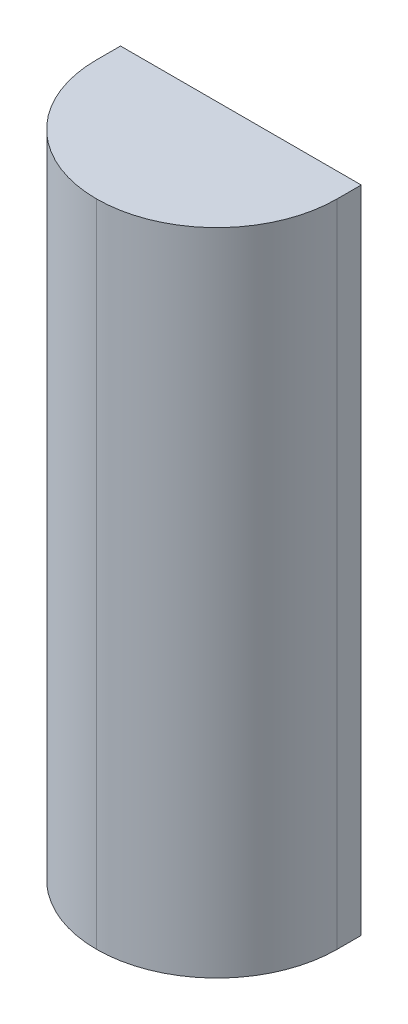
ISO-10303-21;
HEADER;
FILE_DESCRIPTION(('STEP AP214'),'2;1');
FILE_NAME('part.step','',(''),(''),'','','');
FILE_SCHEMA(('AUTOMOTIVE_DESIGN { 1 0 10303 214 1 1 1 1 }'));
ENDSEC;
DATA;
#1=APPLICATION_CONTEXT('core data for automotive mechanical design processes');
#2=APPLICATION_PROTOCOL_DEFINITION('international standard','automotive_design',2000,#1);
#3=PRODUCT_CONTEXT('',#1,'mechanical');
#4=PRODUCT('Part','Part','',(#3));
#5=PRODUCT_RELATED_PRODUCT_CATEGORY('part','',(#4));
#6=PRODUCT_DEFINITION_FORMATION('','',#4);
#7=PRODUCT_DEFINITION_CONTEXT('part definition',#1,'design');
#8=PRODUCT_DEFINITION('design','',#6,#7);
#9=PRODUCT_DEFINITION_SHAPE('','',#8);
#10=(LENGTH_UNIT() NAMED_UNIT(*) SI_UNIT(.MILLI.,.METRE.));
#11=(NAMED_UNIT(*) PLANE_ANGLE_UNIT() SI_UNIT($,.RADIAN.));
#12=(NAMED_UNIT(*) SI_UNIT($,.STERADIAN.) SOLID_ANGLE_UNIT());
#13=UNCERTAINTY_MEASURE_WITH_UNIT(LENGTH_MEASURE(1.E-05),#10,'distance_accuracy_value','');
#14=(GEOMETRIC_REPRESENTATION_CONTEXT(3) GLOBAL_UNCERTAINTY_ASSIGNED_CONTEXT((#13)) GLOBAL_UNIT_ASSIGNED_CONTEXT((#10,
#11,#12)) REPRESENTATION_CONTEXT('',''));
#15=CARTESIAN_POINT('',(0.,0.,0.));
#16=DIRECTION('',(0.,0.,1.));
#17=DIRECTION('',(1.,0.,0.));
#18=AXIS2_PLACEMENT_3D('',#15,#16,#17);
#19=CARTESIAN_POINT('',(2.35,1.35,0.6));
#20=DIRECTION('',(-1.,0.,0.));
#21=DIRECTION('',(0.,0.,1.));
#22=AXIS2_PLACEMENT_3D('',#19,#20,#21);
#23=PLANE('',#22);
#24=DIRECTION('',(0.,0.,-1.));
#25=VECTOR('',#24,1.);
#26=CARTESIAN_POINT('',(2.35,1.35,0.6));
#27=LINE('',#26,#25);
#28=CARTESIAN_POINT('',(2.35,1.35,0.0999999999999999));
#29=VERTEX_POINT('',#28);
#30=CARTESIAN_POINT('',(2.35,1.35,0.));
#31=VERTEX_POINT('',#30);
#32=EDGE_CURVE('E79',#29,#31,#27,.T.);
#33=ORIENTED_EDGE('',*,*,#32,.F.);
#34=DIRECTION('',(0.,1.,0.));
#35=VECTOR('',#34,1.);
#36=CARTESIAN_POINT('',(2.35,-1.35,0.0999999999999999));
#37=LINE('',#36,#35);
#38=CARTESIAN_POINT('',(2.35,-1.35,0.0999999999999999));
#39=VERTEX_POINT('',#38);
#40=EDGE_CURVE('E116',#29,#39,#37,.F.);
#41=ORIENTED_EDGE('',*,*,#40,.T.);
#42=DIRECTION('',(0.,0.,-1.));
#43=VECTOR('',#42,1.);
#44=CARTESIAN_POINT('',(2.35,-1.35,0.6));
#45=LINE('',#44,#43);
#46=CARTESIAN_POINT('',(2.35,-1.35,0.));
#47=VERTEX_POINT('',#46);
#48=EDGE_CURVE('E102',#39,#47,#45,.T.);
#49=ORIENTED_EDGE('',*,*,#48,.T.);
#50=DIRECTION('',(0.,1.,0.));
#51=VECTOR('',#50,1.);
#52=CARTESIAN_POINT('',(2.35,1.35,0.));
#53=LINE('',#52,#51);
#54=EDGE_CURVE('E98',#47,#31,#53,.T.);
#55=ORIENTED_EDGE('',*,*,#54,.T.);
#56=EDGE_LOOP('',(#33,#41,#49,#55));
#57=FACE_BOUND('',#56,.T.);
#58=ADVANCED_FACE('F35',(#57),#23,.F.);
#59=CARTESIAN_POINT('',(1.35,1.35,0.6));
#60=DIRECTION('',(0.,-1.,0.));
#61=DIRECTION('',(0.,0.,-1.));
#62=AXIS2_PLACEMENT_3D('',#59,#60,#61);
#63=PLANE('',#62);
#64=CARTESIAN_POINT('',(1.85,1.35,0.0999999999999999));
#65=DIRECTION('',(0.,-1.,0.));
#66=DIRECTION('',(0.,0.,-1.));
#67=AXIS2_PLACEMENT_3D('',#64,#65,#66);
#68=CIRCLE('',#67,0.5);
#69=CARTESIAN_POINT('',(1.35,1.35,0.0999999999999999));
#70=VERTEX_POINT('',#69);
#71=CARTESIAN_POINT('',(1.85,1.35,0.6));
#72=VERTEX_POINT('',#71);
#73=EDGE_CURVE('E91',#70,#72,#68,.F.);
#74=ORIENTED_EDGE('',*,*,#73,.T.);
#75=CARTESIAN_POINT('',(1.85,1.35,0.0999999999999999));
#76=DIRECTION('',(0.,-1.,0.));
#77=DIRECTION('',(0.,0.,-1.));
#78=AXIS2_PLACEMENT_3D('',#75,#76,#77);
#79=CIRCLE('',#78,0.5);
#80=EDGE_CURVE('E86',#72,#29,#79,.F.);
#81=ORIENTED_EDGE('',*,*,#80,.T.);
#82=ORIENTED_EDGE('',*,*,#32,.T.);
#83=DIRECTION('',(-1.,0.,0.));
#84=VECTOR('',#83,1.);
#85=CARTESIAN_POINT('',(1.35,1.35,0.));
#86=LINE('',#85,#84);
#87=CARTESIAN_POINT('',(1.35,1.35,0.));
#88=VERTEX_POINT('',#87);
#89=EDGE_CURVE('E83',#31,#88,#86,.T.);
#90=ORIENTED_EDGE('',*,*,#89,.T.);
#91=DIRECTION('',(0.,0.,-1.));
#92=VECTOR('',#91,1.);
#93=CARTESIAN_POINT('',(1.35,1.35,0.6));
#94=LINE('',#93,#92);
#95=EDGE_CURVE('E92',#70,#88,#94,.T.);
#96=ORIENTED_EDGE('',*,*,#95,.F.);
#97=EDGE_LOOP('',(#74,#81,#82,#90,#96));
#98=FACE_BOUND('',#97,.T.);
#99=ADVANCED_FACE('F81',(#98),#63,.F.);
#100=CARTESIAN_POINT('',(1.35,1.35,0.6));
#101=DIRECTION('',(1.,0.,0.));
#102=DIRECTION('',(0.,1.,0.));
#103=AXIS2_PLACEMENT_3D('',#100,#101,#102);
#104=PLANE('',#103);
#105=DIRECTION('',(0.,0.,-1.));
#106=VECTOR('',#105,1.);
#107=CARTESIAN_POINT('',(1.35,-1.35,0.6));
#108=LINE('',#107,#106);
#109=CARTESIAN_POINT('',(1.35,-1.35,0.0999999999999999));
#110=VERTEX_POINT('',#109);
#111=CARTESIAN_POINT('',(1.35,-1.35,0.));
#112=VERTEX_POINT('',#111);
#113=EDGE_CURVE('E111',#110,#112,#108,.T.);
#114=ORIENTED_EDGE('',*,*,#113,.F.);
#115=DIRECTION('',(0.,-1.,0.));
#116=VECTOR('',#115,1.);
#117=CARTESIAN_POINT('',(1.35,1.35,0.0999999999999999));
#118=LINE('',#117,#116);
#119=EDGE_CURVE('E11',#110,#70,#118,.F.);
#120=ORIENTED_EDGE('',*,*,#119,.T.);
#121=ORIENTED_EDGE('',*,*,#95,.T.);
#122=DIRECTION('',(0.,-1.,0.));
#123=VECTOR('',#122,1.);
#124=CARTESIAN_POINT('',(1.35,1.35,0.));
#125=LINE('',#124,#123);
#126=EDGE_CURVE('E100',#88,#112,#125,.T.);
#127=ORIENTED_EDGE('',*,*,#126,.T.);
#128=EDGE_LOOP('',(#114,#120,#121,#127));
#129=FACE_BOUND('',#128,.T.);
#130=ADVANCED_FACE('F123',(#129),#104,.F.);
#131=CARTESIAN_POINT('',(1.35,-1.35,0.6));
#132=DIRECTION('',(0.,1.,0.));
#133=DIRECTION('',(0.,0.,1.));
#134=AXIS2_PLACEMENT_3D('',#131,#132,#133);
#135=PLANE('',#134);
#136=ORIENTED_EDGE('',*,*,#48,.F.);
#137=CARTESIAN_POINT('',(1.85,-1.35,0.0999999999999999));
#138=DIRECTION('',(0.,1.,0.));
#139=DIRECTION('',(0.,0.,1.));
#140=AXIS2_PLACEMENT_3D('',#137,#138,#139);
#141=CIRCLE('',#140,0.5);
#142=CARTESIAN_POINT('',(1.85,-1.35,0.6));
#143=VERTEX_POINT('',#142);
#144=EDGE_CURVE('E44',#39,#143,#141,.F.);
#145=ORIENTED_EDGE('',*,*,#144,.T.);
#146=CARTESIAN_POINT('',(1.85,-1.35,0.0999999999999999));
#147=DIRECTION('',(0.,1.,0.));
#148=DIRECTION('',(0.,0.,1.));
#149=AXIS2_PLACEMENT_3D('',#146,#147,#148);
#150=CIRCLE('',#149,0.5);
#151=EDGE_CURVE('E51',#143,#110,#150,.F.);
#152=ORIENTED_EDGE('',*,*,#151,.T.);
#153=ORIENTED_EDGE('',*,*,#113,.T.);
#154=DIRECTION('',(1.,0.,0.));
#155=VECTOR('',#154,1.);
#156=CARTESIAN_POINT('',(1.35,-1.35,0.));
#157=LINE('',#156,#155);
#158=EDGE_CURVE('E108',#112,#47,#157,.T.);
#159=ORIENTED_EDGE('',*,*,#158,.T.);
#160=EDGE_LOOP('',(#136,#145,#152,#153,#159));
#161=FACE_BOUND('',#160,.T.);
#162=ADVANCED_FACE('F120',(#161),#135,.F.);
#163=CARTESIAN_POINT('',(0.,0.,0.));
#164=DIRECTION('',(0.,0.,1.));
#165=DIRECTION('',(1.,0.,0.));
#166=AXIS2_PLACEMENT_3D('',#163,#164,#165);
#167=PLANE('',#166);
#168=ORIENTED_EDGE('',*,*,#54,.F.);
#169=ORIENTED_EDGE('',*,*,#158,.F.);
#170=ORIENTED_EDGE('',*,*,#126,.F.);
#171=ORIENTED_EDGE('',*,*,#89,.F.);
#172=EDGE_LOOP('',(#168,#169,#170,#171));
#173=FACE_BOUND('',#172,.T.);
#174=ADVANCED_FACE('F96',(#173),#167,.F.);
#175=CARTESIAN_POINT('',(1.85,0.,0.0999999999999999));
#176=DIRECTION('',(0.,1.,0.));
#177=DIRECTION('',(-1.,0.,0.));
#178=AXIS2_PLACEMENT_3D('',#175,#176,#177);
#179=CYLINDRICAL_SURFACE('',#178,0.5);
#180=ORIENTED_EDGE('',*,*,#119,.F.);
#181=ORIENTED_EDGE('',*,*,#151,.F.);
#182=DIRECTION('',(0.,-1.,0.));
#183=VECTOR('',#182,1.);
#184=CARTESIAN_POINT('',(1.85,-1.35,0.6));
#185=LINE('',#184,#183);
#186=EDGE_CURVE('E39',#72,#143,#185,.T.);
#187=ORIENTED_EDGE('',*,*,#186,.F.);
#188=ORIENTED_EDGE('',*,*,#73,.F.);
#189=EDGE_LOOP('',(#180,#181,#187,#188));
#190=FACE_BOUND('',#189,.T.);
#191=ADVANCED_FACE('F37',(#190),#179,.T.);
#192=CARTESIAN_POINT('',(1.85,0.,0.0999999999999999));
#193=DIRECTION('',(0.,-1.,0.));
#194=DIRECTION('',(0.,0.,-1.));
#195=AXIS2_PLACEMENT_3D('',#192,#193,#194);
#196=CYLINDRICAL_SURFACE('',#195,0.5);
#197=ORIENTED_EDGE('',*,*,#144,.F.);
#198=ORIENTED_EDGE('',*,*,#40,.F.);
#199=ORIENTED_EDGE('',*,*,#80,.F.);
#200=ORIENTED_EDGE('',*,*,#186,.T.);
#201=EDGE_LOOP('',(#197,#198,#199,#200));
#202=FACE_BOUND('',#201,.T.);
#203=ADVANCED_FACE('F127',(#202),#196,.T.);
#204=CLOSED_SHELL('',(#58,#99,#130,#162,#174,#191,#203));
#205=MANIFOLD_SOLID_BREP('B2',#204);
#206=ADVANCED_BREP_SHAPE_REPRESENTATION('',(#18,#205),#14);
#207=SHAPE_DEFINITION_REPRESENTATION(#9,#206);
ENDSEC;
END-ISO-10303-21;
